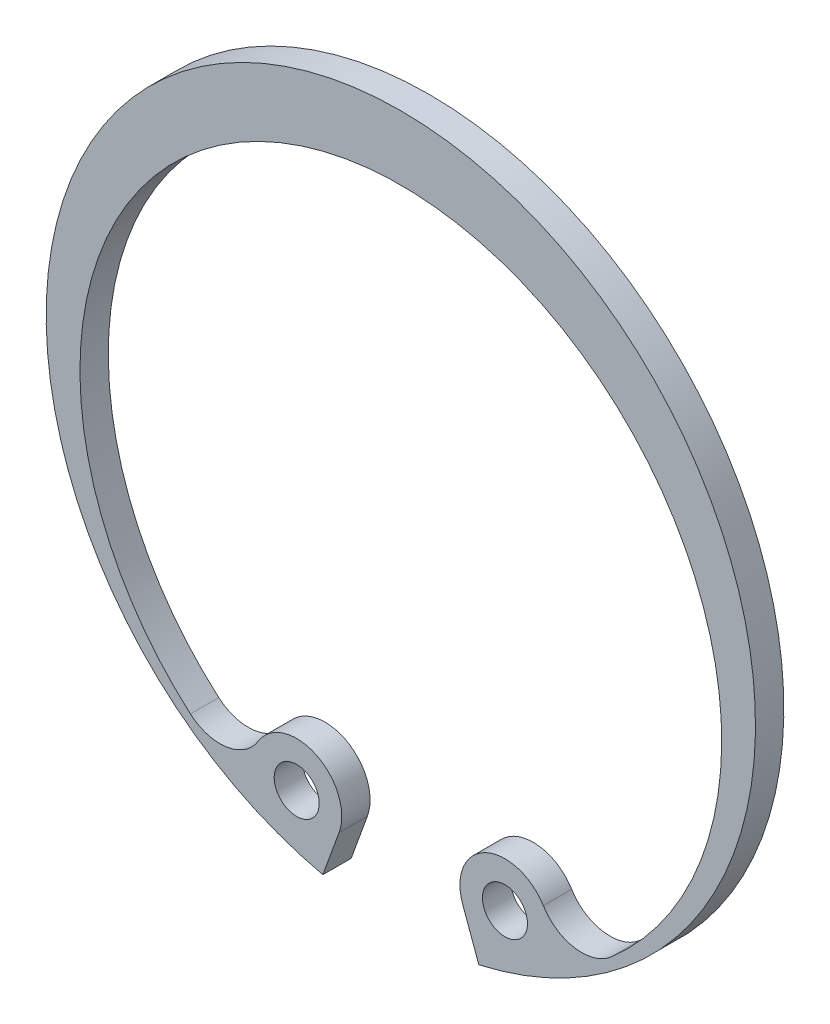
ISO-10303-21;
HEADER;
FILE_DESCRIPTION(('STEP AP214'),'2;1');
FILE_NAME('part.step','',(''),(''),'','','');
FILE_SCHEMA(('AUTOMOTIVE_DESIGN { 1 0 10303 214 1 1 1 1 }'));
ENDSEC;
DATA;
#1=APPLICATION_CONTEXT('core data for automotive mechanical design processes');
#2=APPLICATION_PROTOCOL_DEFINITION('international standard','automotive_design',2000,#1);
#3=PRODUCT_CONTEXT('',#1,'mechanical');
#4=PRODUCT('Part','Part','',(#3));
#5=PRODUCT_RELATED_PRODUCT_CATEGORY('part','',(#4));
#6=PRODUCT_DEFINITION_FORMATION('','',#4);
#7=PRODUCT_DEFINITION_CONTEXT('part definition',#1,'design');
#8=PRODUCT_DEFINITION('design','',#6,#7);
#9=PRODUCT_DEFINITION_SHAPE('','',#8);
#10=(LENGTH_UNIT() NAMED_UNIT(*) SI_UNIT(.MILLI.,.METRE.));
#11=(NAMED_UNIT(*) PLANE_ANGLE_UNIT() SI_UNIT($,.RADIAN.));
#12=(NAMED_UNIT(*) SI_UNIT($,.STERADIAN.) SOLID_ANGLE_UNIT());
#13=UNCERTAINTY_MEASURE_WITH_UNIT(LENGTH_MEASURE(1.E-05),#10,'distance_accuracy_value','');
#14=(GEOMETRIC_REPRESENTATION_CONTEXT(3) GLOBAL_UNCERTAINTY_ASSIGNED_CONTEXT((#13)) GLOBAL_UNIT_ASSIGNED_CONTEXT((#10,
#11,#12)) REPRESENTATION_CONTEXT('',''));
#15=CARTESIAN_POINT('',(0.,0.,0.));
#16=DIRECTION('',(0.,0.,1.));
#17=DIRECTION('',(1.,0.,0.));
#18=AXIS2_PLACEMENT_3D('',#15,#16,#17);
#19=CARTESIAN_POINT('',(0.,0.,1.175));
#20=DIRECTION('',(0.,0.,-1.));
#21=DIRECTION('',(-1.,0.,0.));
#22=AXIS2_PLACEMENT_3D('',#19,#20,#21);
#23=CYLINDRICAL_SURFACE('',#22,14.7);
#24=CARTESIAN_POINT('',(0.,0.,1.175));
#25=DIRECTION('',(0.,0.,-1.));
#26=DIRECTION('',(-1.,0.,0.));
#27=AXIS2_PLACEMENT_3D('',#24,#25,#26);
#28=CIRCLE('',#27,14.7);
#29=CARTESIAN_POINT('',(-3.23290275384391,-14.3400955291165,1.175));
#30=VERTEX_POINT('',#29);
#31=CARTESIAN_POINT('',(3.23290275384391,-14.3400955291165,1.175));
#32=VERTEX_POINT('',#31);
#33=EDGE_CURVE('E49',#30,#32,#28,.T.);
#34=ORIENTED_EDGE('',*,*,#33,.F.);
#35=DIRECTION('',(0.,0.,-1.));
#36=VECTOR('',#35,1.);
#37=CARTESIAN_POINT('',(-3.23290275384391,-14.3400955291165,2.35));
#38=LINE('',#37,#36);
#39=CARTESIAN_POINT('',(-3.23290275384391,-14.3400955291165,2.35));
#40=VERTEX_POINT('',#39);
#41=EDGE_CURVE('E11',#40,#30,#38,.T.);
#42=ORIENTED_EDGE('',*,*,#41,.F.);
#43=CARTESIAN_POINT('',(0.,0.,2.35));
#44=DIRECTION('',(0.,0.,1.));
#45=DIRECTION('',(1.,0.,0.));
#46=AXIS2_PLACEMENT_3D('',#43,#44,#45);
#47=CIRCLE('',#46,14.7);
#48=CARTESIAN_POINT('',(3.23290275384392,-14.3400955291165,2.35));
#49=VERTEX_POINT('',#48);
#50=EDGE_CURVE('E118',#49,#40,#47,.T.);
#51=ORIENTED_EDGE('',*,*,#50,.F.);
#52=DIRECTION('',(0.,0.,-1.));
#53=VECTOR('',#52,1.);
#54=CARTESIAN_POINT('',(3.23290275384392,-14.3400955291165,2.35));
#55=LINE('',#54,#53);
#56=EDGE_CURVE('E111',#49,#32,#55,.T.);
#57=ORIENTED_EDGE('',*,*,#56,.T.);
#58=EDGE_LOOP('',(#34,#42,#51,#57));
#59=FACE_BOUND('',#58,.T.);
#60=ADVANCED_FACE('F33',(#59),#23,.T.);
#61=CARTESIAN_POINT('',(0.,0.,2.35));
#62=DIRECTION('',(0.,0.,1.));
#63=DIRECTION('',(1.,0.,0.));
#64=AXIS2_PLACEMENT_3D('',#61,#62,#63);
#65=PLANE('',#64);
#66=CARTESIAN_POINT('',(4.31577740143819,-11.8575009578439,2.35));
#67=DIRECTION('',(0.,0.,1.));
#68=DIRECTION('',(1.,0.,0.));
#69=AXIS2_PLACEMENT_3D('',#66,#67,#68);
#70=CIRCLE('',#69,0.933333333333334);
#71=CARTESIAN_POINT('',(5.24911073477153,-11.8575009578439,2.35));
#72=VERTEX_POINT('',#71);
#73=EDGE_CURVE('E105',#72,#72,#70,.T.);
#74=ORIENTED_EDGE('',*,*,#73,.F.);
#75=EDGE_LOOP('',(#74));
#76=FACE_BOUND('',#75,.T.);
#77=ORIENTED_EDGE('',*,*,#50,.T.);
#78=DIRECTION('',(0.34202014332567,0.939692620785908,0.));
#79=VECTOR('',#78,1.);
#80=CARTESIAN_POINT('',(-2.56168450930449,-12.4959385587185,2.35));
#81=LINE('',#80,#79);
#82=CARTESIAN_POINT('',(-2.56168450930449,-12.4959385587185,2.35));
#83=VERTEX_POINT('',#82);
#84=EDGE_CURVE('E115',#40,#83,#81,.T.);
#85=ORIENTED_EDGE('',*,*,#84,.T.);
#86=CARTESIAN_POINT('',(-4.31577740143819,-11.857500957844,2.35));
#87=DIRECTION('',(0.,0.,1.));
#88=DIRECTION('',(1.,0.,0.));
#89=AXIS2_PLACEMENT_3D('',#86,#87,#88);
#90=CIRCLE('',#89,1.86666666666667);
#91=CARTESIAN_POINT('',(-5.90611589647311,-10.8801228755981,2.35));
#92=VERTEX_POINT('',#91);
#93=EDGE_CURVE('E117',#83,#92,#90,.T.);
#94=ORIENTED_EDGE('',*,*,#93,.T.);
#95=CARTESIAN_POINT('',(-7.49645439150802,-9.9027447933523,2.35));
#96=DIRECTION('',(0.,0.,-1.));
#97=DIRECTION('',(1.,0.,0.));
#98=AXIS2_PLACEMENT_3D('',#95,#96,#97);
#99=CIRCLE('',#98,1.86666666666667);
#100=CARTESIAN_POINT('',(-8.72036531257056,-11.3121725147159,2.35));
#101=VERTEX_POINT('',#100);
#102=EDGE_CURVE('E130',#92,#101,#99,.T.);
#103=ORIENTED_EDGE('',*,*,#102,.T.);
#104=CARTESIAN_POINT('',(0.,-1.27,2.35));
#105=DIRECTION('',(0.,0.,-1.));
#106=DIRECTION('',(1.,0.,0.));
#107=AXIS2_PLACEMENT_3D('',#104,#105,#106);
#108=CIRCLE('',#107,13.3);
#109=CARTESIAN_POINT('',(8.72036531257056,-11.3121725147159,2.35));
#110=VERTEX_POINT('',#109);
#111=EDGE_CURVE('E132',#101,#110,#108,.T.);
#112=ORIENTED_EDGE('',*,*,#111,.T.);
#113=CARTESIAN_POINT('',(7.49645439150802,-9.9027447933523,2.35));
#114=DIRECTION('',(0.,0.,-1.));
#115=DIRECTION('',(-1.,0.,0.));
#116=AXIS2_PLACEMENT_3D('',#113,#114,#115);
#117=CIRCLE('',#116,1.86666666666667);
#118=CARTESIAN_POINT('',(5.90611589647311,-10.8801228755981,2.35));
#119=VERTEX_POINT('',#118);
#120=EDGE_CURVE('E134',#110,#119,#117,.T.);
#121=ORIENTED_EDGE('',*,*,#120,.T.);
#122=CARTESIAN_POINT('',(4.31577740143819,-11.8575009578439,2.35));
#123=DIRECTION('',(0.,0.,1.));
#124=DIRECTION('',(-1.,0.,0.));
#125=AXIS2_PLACEMENT_3D('',#122,#123,#124);
#126=CIRCLE('',#125,1.86666666666667);
#127=CARTESIAN_POINT('',(2.5616845093045,-12.4959385587185,2.35));
#128=VERTEX_POINT('',#127);
#129=EDGE_CURVE('E136',#119,#128,#126,.T.);
#130=ORIENTED_EDGE('',*,*,#129,.T.);
#131=DIRECTION('',(0.34202014332567,-0.939692620785908,0.));
#132=VECTOR('',#131,1.);
#133=CARTESIAN_POINT('',(2.5616845093045,-12.4959385587185,2.35));
#134=LINE('',#133,#132);
#135=EDGE_CURVE('E57',#128,#49,#134,.T.);
#136=ORIENTED_EDGE('',*,*,#135,.T.);
#137=EDGE_LOOP('',(#77,#85,#94,#103,#112,#121,#130,#136));
#138=FACE_BOUND('',#137,.T.);
#139=CARTESIAN_POINT('',(-4.31577740143819,-11.857500957844,2.35));
#140=DIRECTION('',(0.,0.,1.));
#141=DIRECTION('',(1.,0.,0.));
#142=AXIS2_PLACEMENT_3D('',#139,#140,#141);
#143=CIRCLE('',#142,0.933333333333334);
#144=CARTESIAN_POINT('',(-3.38244406810486,-11.857500957844,2.35));
#145=VERTEX_POINT('',#144);
#146=EDGE_CURVE('E229',#145,#145,#143,.T.);
#147=ORIENTED_EDGE('',*,*,#146,.F.);
#148=EDGE_LOOP('',(#147));
#149=FACE_BOUND('',#148,.T.);
#150=ADVANCED_FACE('F120',(#76,#138,#149),#65,.T.);
#151=CARTESIAN_POINT('',(-2.56168450930449,-12.4959385587185,2.35));
#152=DIRECTION('',(-0.939692620785908,0.34202014332567,0.));
#153=DIRECTION('',(-0.34202014332567,-0.939692620785908,0.));
#154=AXIS2_PLACEMENT_3D('',#151,#152,#153);
#155=PLANE('',#154);
#156=DIRECTION('',(0.34202014332567,0.939692620785908,0.));
#157=VECTOR('',#156,1.);
#158=CARTESIAN_POINT('',(-2.56168450930449,-12.4959385587185,1.175));
#159=LINE('',#158,#157);
#160=CARTESIAN_POINT('',(-2.56168450930449,-12.4959385587185,1.175));
#161=VERTEX_POINT('',#160);
#162=EDGE_CURVE('E98',#30,#161,#159,.T.);
#163=ORIENTED_EDGE('',*,*,#162,.T.);
#164=DIRECTION('',(0.,0.,-1.));
#165=VECTOR('',#164,1.);
#166=CARTESIAN_POINT('',(-2.56168450930449,-12.4959385587185,2.35));
#167=LINE('',#166,#165);
#168=EDGE_CURVE('E41',#83,#161,#167,.T.);
#169=ORIENTED_EDGE('',*,*,#168,.F.);
#170=ORIENTED_EDGE('',*,*,#84,.F.);
#171=ORIENTED_EDGE('',*,*,#41,.T.);
#172=EDGE_LOOP('',(#163,#169,#170,#171));
#173=FACE_BOUND('',#172,.T.);
#174=ADVANCED_FACE('F114',(#173),#155,.F.);
#175=CARTESIAN_POINT('',(-4.31577740143819,-11.857500957844,2.35));
#176=DIRECTION('',(0.,0.,-1.));
#177=DIRECTION('',(-1.,0.,0.));
#178=AXIS2_PLACEMENT_3D('',#175,#176,#177);
#179=CYLINDRICAL_SURFACE('',#178,1.86666666666667);
#180=CARTESIAN_POINT('',(-4.31577740143819,-11.857500957844,1.175));
#181=DIRECTION('',(0.,0.,1.));
#182=DIRECTION('',(1.,0.,0.));
#183=AXIS2_PLACEMENT_3D('',#180,#181,#182);
#184=CIRCLE('',#183,1.86666666666667);
#185=CARTESIAN_POINT('',(-5.90611589647311,-10.8801228755981,1.175));
#186=VERTEX_POINT('',#185);
#187=EDGE_CURVE('E101',#161,#186,#184,.T.);
#188=ORIENTED_EDGE('',*,*,#187,.T.);
#189=DIRECTION('',(0.,0.,-1.));
#190=VECTOR('',#189,1.);
#191=CARTESIAN_POINT('',(-5.90611589647311,-10.8801228755981,2.35));
#192=LINE('',#191,#190);
#193=EDGE_CURVE('E172',#92,#186,#192,.T.);
#194=ORIENTED_EDGE('',*,*,#193,.F.);
#195=ORIENTED_EDGE('',*,*,#93,.F.);
#196=ORIENTED_EDGE('',*,*,#168,.T.);
#197=EDGE_LOOP('',(#188,#194,#195,#196));
#198=FACE_BOUND('',#197,.T.);
#199=ADVANCED_FACE('F178',(#198),#179,.T.);
#200=CARTESIAN_POINT('',(-7.49645439150802,-9.9027447933523,2.35));
#201=DIRECTION('',(0.,0.,-1.));
#202=DIRECTION('',(-1.,0.,0.));
#203=AXIS2_PLACEMENT_3D('',#200,#201,#202);
#204=CYLINDRICAL_SURFACE('',#203,1.86666666666667);
#205=CARTESIAN_POINT('',(-7.49645439150802,-9.9027447933523,1.175));
#206=DIRECTION('',(0.,0.,-1.));
#207=DIRECTION('',(1.,0.,0.));
#208=AXIS2_PLACEMENT_3D('',#205,#206,#207);
#209=CIRCLE('',#208,1.86666666666667);
#210=CARTESIAN_POINT('',(-8.72036531257056,-11.3121725147159,1.175));
#211=VERTEX_POINT('',#210);
#212=EDGE_CURVE('E140',#186,#211,#209,.T.);
#213=ORIENTED_EDGE('',*,*,#212,.T.);
#214=DIRECTION('',(0.,0.,-1.));
#215=VECTOR('',#214,1.);
#216=CARTESIAN_POINT('',(-8.72036531257056,-11.3121725147159,2.35));
#217=LINE('',#216,#215);
#218=EDGE_CURVE('E167',#101,#211,#217,.T.);
#219=ORIENTED_EDGE('',*,*,#218,.F.);
#220=ORIENTED_EDGE('',*,*,#102,.F.);
#221=ORIENTED_EDGE('',*,*,#193,.T.);
#222=EDGE_LOOP('',(#213,#219,#220,#221));
#223=FACE_BOUND('',#222,.T.);
#224=ADVANCED_FACE('F185',(#223),#204,.F.);
#225=CARTESIAN_POINT('',(0.,-1.27,2.35));
#226=DIRECTION('',(0.,0.,-1.));
#227=DIRECTION('',(-1.,0.,0.));
#228=AXIS2_PLACEMENT_3D('',#225,#226,#227);
#229=CYLINDRICAL_SURFACE('',#228,13.3);
#230=CARTESIAN_POINT('',(0.,-1.27,1.175));
#231=DIRECTION('',(0.,0.,-1.));
#232=DIRECTION('',(1.,0.,0.));
#233=AXIS2_PLACEMENT_3D('',#230,#231,#232);
#234=CIRCLE('',#233,13.3);
#235=CARTESIAN_POINT('',(8.72036531257056,-11.3121725147159,1.175));
#236=VERTEX_POINT('',#235);
#237=EDGE_CURVE('E143',#211,#236,#234,.T.);
#238=ORIENTED_EDGE('',*,*,#237,.T.);
#239=DIRECTION('',(0.,0.,-1.));
#240=VECTOR('',#239,1.);
#241=CARTESIAN_POINT('',(8.72036531257056,-11.3121725147159,2.35));
#242=LINE('',#241,#240);
#243=EDGE_CURVE('E162',#110,#236,#242,.T.);
#244=ORIENTED_EDGE('',*,*,#243,.F.);
#245=ORIENTED_EDGE('',*,*,#111,.F.);
#246=ORIENTED_EDGE('',*,*,#218,.T.);
#247=EDGE_LOOP('',(#238,#244,#245,#246));
#248=FACE_BOUND('',#247,.T.);
#249=ADVANCED_FACE('F187',(#248),#229,.F.);
#250=CARTESIAN_POINT('',(7.49645439150802,-9.9027447933523,2.35));
#251=DIRECTION('',(0.,0.,-1.));
#252=DIRECTION('',(-1.,0.,0.));
#253=AXIS2_PLACEMENT_3D('',#250,#251,#252);
#254=CYLINDRICAL_SURFACE('',#253,1.86666666666667);
#255=CARTESIAN_POINT('',(7.49645439150802,-9.9027447933523,1.175));
#256=DIRECTION('',(0.,0.,-1.));
#257=DIRECTION('',(-1.,0.,0.));
#258=AXIS2_PLACEMENT_3D('',#255,#256,#257);
#259=CIRCLE('',#258,1.86666666666667);
#260=CARTESIAN_POINT('',(5.90611589647311,-10.8801228755981,1.175));
#261=VERTEX_POINT('',#260);
#262=EDGE_CURVE('E146',#236,#261,#259,.T.);
#263=ORIENTED_EDGE('',*,*,#262,.T.);
#264=DIRECTION('',(0.,0.,-1.));
#265=VECTOR('',#264,1.);
#266=CARTESIAN_POINT('',(5.90611589647311,-10.8801228755981,2.35));
#267=LINE('',#266,#265);
#268=EDGE_CURVE('E158',#119,#261,#267,.T.);
#269=ORIENTED_EDGE('',*,*,#268,.F.);
#270=ORIENTED_EDGE('',*,*,#120,.F.);
#271=ORIENTED_EDGE('',*,*,#243,.T.);
#272=EDGE_LOOP('',(#263,#269,#270,#271));
#273=FACE_BOUND('',#272,.T.);
#274=ADVANCED_FACE('F190',(#273),#254,.F.);
#275=CARTESIAN_POINT('',(4.31577740143819,-11.8575009578439,2.35));
#276=DIRECTION('',(0.,0.,-1.));
#277=DIRECTION('',(-1.,0.,0.));
#278=AXIS2_PLACEMENT_3D('',#275,#276,#277);
#279=CYLINDRICAL_SURFACE('',#278,1.86666666666667);
#280=CARTESIAN_POINT('',(4.31577740143819,-11.8575009578439,1.175));
#281=DIRECTION('',(0.,0.,1.));
#282=DIRECTION('',(-1.,0.,0.));
#283=AXIS2_PLACEMENT_3D('',#280,#281,#282);
#284=CIRCLE('',#283,1.86666666666667);
#285=CARTESIAN_POINT('',(2.5616845093045,-12.4959385587185,1.175));
#286=VERTEX_POINT('',#285);
#287=EDGE_CURVE('E124',#261,#286,#284,.T.);
#288=ORIENTED_EDGE('',*,*,#287,.T.);
#289=DIRECTION('',(0.,0.,-1.));
#290=VECTOR('',#289,1.);
#291=CARTESIAN_POINT('',(2.5616845093045,-12.4959385587185,2.35));
#292=LINE('',#291,#290);
#293=EDGE_CURVE('E153',#128,#286,#292,.T.);
#294=ORIENTED_EDGE('',*,*,#293,.F.);
#295=ORIENTED_EDGE('',*,*,#129,.F.);
#296=ORIENTED_EDGE('',*,*,#268,.T.);
#297=EDGE_LOOP('',(#288,#294,#295,#296));
#298=FACE_BOUND('',#297,.T.);
#299=ADVANCED_FACE('F191',(#298),#279,.T.);
#300=CARTESIAN_POINT('',(2.5616845093045,-12.4959385587185,2.35));
#301=DIRECTION('',(0.939692620785908,0.34202014332567,0.));
#302=DIRECTION('',(-0.34202014332567,0.939692620785908,0.));
#303=AXIS2_PLACEMENT_3D('',#300,#301,#302);
#304=PLANE('',#303);
#305=DIRECTION('',(0.34202014332567,-0.939692620785908,0.));
#306=VECTOR('',#305,1.);
#307=CARTESIAN_POINT('',(2.5616845093045,-12.4959385587185,1.175));
#308=LINE('',#307,#306);
#309=EDGE_CURVE('E122',#286,#32,#308,.T.);
#310=ORIENTED_EDGE('',*,*,#309,.T.);
#311=ORIENTED_EDGE('',*,*,#56,.F.);
#312=ORIENTED_EDGE('',*,*,#135,.F.);
#313=ORIENTED_EDGE('',*,*,#293,.T.);
#314=EDGE_LOOP('',(#310,#311,#312,#313));
#315=FACE_BOUND('',#314,.T.);
#316=ADVANCED_FACE('F192',(#315),#304,.F.);
#317=CARTESIAN_POINT('',(4.31577740143819,-11.8575009578439,2.35));
#318=DIRECTION('',(0.,0.,-1.));
#319=DIRECTION('',(-1.,0.,0.));
#320=AXIS2_PLACEMENT_3D('',#317,#318,#319);
#321=CYLINDRICAL_SURFACE('',#320,0.933333333333334);
#322=ORIENTED_EDGE('',*,*,#73,.T.);
#323=EDGE_LOOP('',(#322));
#324=FACE_BOUND('',#323,.T.);
#325=CARTESIAN_POINT('',(4.31577740143819,-11.8575009578439,1.175));
#326=DIRECTION('',(0.,0.,-1.));
#327=DIRECTION('',(-1.,0.,0.));
#328=AXIS2_PLACEMENT_3D('',#325,#326,#327);
#329=CIRCLE('',#328,0.933333333333334);
#330=CARTESIAN_POINT('',(3.38244406810486,-11.8575009578439,1.175));
#331=VERTEX_POINT('',#330);
#332=EDGE_CURVE('E227',#331,#331,#329,.T.);
#333=ORIENTED_EDGE('',*,*,#332,.T.);
#334=EDGE_LOOP('',(#333));
#335=FACE_BOUND('',#334,.T.);
#336=ADVANCED_FACE('F194',(#324,#335),#321,.F.);
#337=CARTESIAN_POINT('',(-4.31577740143819,-11.857500957844,2.35));
#338=DIRECTION('',(0.,0.,-1.));
#339=DIRECTION('',(-1.,0.,0.));
#340=AXIS2_PLACEMENT_3D('',#337,#338,#339);
#341=CYLINDRICAL_SURFACE('',#340,0.933333333333334);
#342=ORIENTED_EDGE('',*,*,#146,.T.);
#343=EDGE_LOOP('',(#342));
#344=FACE_BOUND('',#343,.T.);
#345=CARTESIAN_POINT('',(-4.31577740143819,-11.857500957844,1.175));
#346=DIRECTION('',(0.,0.,-1.));
#347=DIRECTION('',(-1.,0.,0.));
#348=AXIS2_PLACEMENT_3D('',#345,#346,#347);
#349=CIRCLE('',#348,0.933333333333334);
#350=CARTESIAN_POINT('',(-5.24911073477152,-11.857500957844,1.175));
#351=VERTEX_POINT('',#350);
#352=EDGE_CURVE('E112',#351,#351,#349,.T.);
#353=ORIENTED_EDGE('',*,*,#352,.T.);
#354=EDGE_LOOP('',(#353));
#355=FACE_BOUND('',#354,.T.);
#356=ADVANCED_FACE('F200',(#344,#355),#341,.F.);
#357=CARTESIAN_POINT('',(0.,0.,1.175));
#358=DIRECTION('',(0.,0.,-1.));
#359=DIRECTION('',(-1.,0.,0.));
#360=AXIS2_PLACEMENT_3D('',#357,#358,#359);
#361=PLANE('',#360);
#362=ORIENTED_EDGE('',*,*,#352,.F.);
#363=EDGE_LOOP('',(#362));
#364=FACE_BOUND('',#363,.T.);
#365=ORIENTED_EDGE('',*,*,#332,.F.);
#366=EDGE_LOOP('',(#365));
#367=FACE_BOUND('',#366,.T.);
#368=ORIENTED_EDGE('',*,*,#162,.F.);
#369=ORIENTED_EDGE('',*,*,#33,.T.);
#370=ORIENTED_EDGE('',*,*,#309,.F.);
#371=ORIENTED_EDGE('',*,*,#287,.F.);
#372=ORIENTED_EDGE('',*,*,#262,.F.);
#373=ORIENTED_EDGE('',*,*,#237,.F.);
#374=ORIENTED_EDGE('',*,*,#212,.F.);
#375=ORIENTED_EDGE('',*,*,#187,.F.);
#376=EDGE_LOOP('',(#368,#369,#370,#371,#372,#373,#374,#375));
#377=FACE_BOUND('',#376,.T.);
#378=ADVANCED_FACE('F99',(#364,#367,#377),#361,.T.);
#379=CLOSED_SHELL('',(#60,#150,#174,#199,#224,#249,#274,#299,#316,#336,#356,#378));
#380=MANIFOLD_SOLID_BREP('B2',#379);
#381=ADVANCED_BREP_SHAPE_REPRESENTATION('',(#18,#380),#14);
#382=SHAPE_DEFINITION_REPRESENTATION(#9,#381);
ENDSEC;
END-ISO-10303-21;
